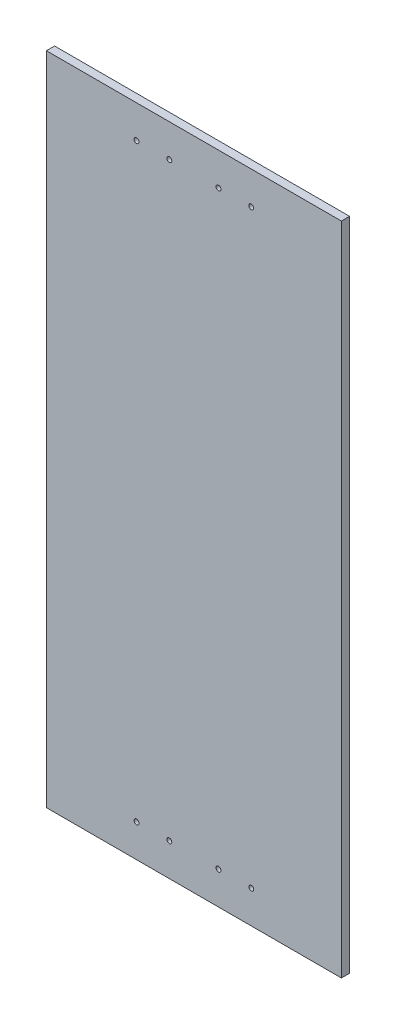
ISO-10303-21;
HEADER;
FILE_DESCRIPTION(('STEP AP214'),'2;1');
FILE_NAME('part.step','',(''),(''),'','','');
FILE_SCHEMA(('AUTOMOTIVE_DESIGN { 1 0 10303 214 1 1 1 1 }'));
ENDSEC;
DATA;
#1=APPLICATION_CONTEXT('core data for automotive mechanical design processes');
#2=APPLICATION_PROTOCOL_DEFINITION('international standard','automotive_design',2000,#1);
#3=PRODUCT_CONTEXT('',#1,'mechanical');
#4=PRODUCT('Part','Part','',(#3));
#5=PRODUCT_RELATED_PRODUCT_CATEGORY('part','',(#4));
#6=PRODUCT_DEFINITION_FORMATION('','',#4);
#7=PRODUCT_DEFINITION_CONTEXT('part definition',#1,'design');
#8=PRODUCT_DEFINITION('design','',#6,#7);
#9=PRODUCT_DEFINITION_SHAPE('','',#8);
#10=(LENGTH_UNIT() NAMED_UNIT(*) SI_UNIT(.MILLI.,.METRE.));
#11=(NAMED_UNIT(*) PLANE_ANGLE_UNIT() SI_UNIT($,.RADIAN.));
#12=(NAMED_UNIT(*) SI_UNIT($,.STERADIAN.) SOLID_ANGLE_UNIT());
#13=UNCERTAINTY_MEASURE_WITH_UNIT(LENGTH_MEASURE(1.E-05),#10,'distance_accuracy_value','');
#14=(GEOMETRIC_REPRESENTATION_CONTEXT(3) GLOBAL_UNCERTAINTY_ASSIGNED_CONTEXT((#13)) GLOBAL_UNIT_ASSIGNED_CONTEXT((#10,
#11,#12)) REPRESENTATION_CONTEXT('',''));
#15=CARTESIAN_POINT('',(0.,0.,0.));
#16=DIRECTION('',(0.,0.,1.));
#17=DIRECTION('',(1.,0.,0.));
#18=AXIS2_PLACEMENT_3D('',#15,#16,#17);
#19=CARTESIAN_POINT('',(0.,0.,5.));
#20=DIRECTION('',(0.,0.,-1.));
#21=DIRECTION('',(-1.,0.,0.));
#22=AXIS2_PLACEMENT_3D('',#19,#20,#21);
#23=PLANE('',#22);
#24=DIRECTION('',(0.,1.,0.));
#25=VECTOR('',#24,1.);
#26=CARTESIAN_POINT('',(90.,-200.,5.));
#27=LINE('',#26,#25);
#28=CARTESIAN_POINT('',(90.,-200.,5.));
#29=VERTEX_POINT('',#28);
#30=CARTESIAN_POINT('',(90.,200.,5.));
#31=VERTEX_POINT('',#30);
#32=EDGE_CURVE('E89',#29,#31,#27,.T.);
#33=ORIENTED_EDGE('',*,*,#32,.T.);
#34=DIRECTION('',(-1.,0.,0.));
#35=VECTOR('',#34,1.);
#36=CARTESIAN_POINT('',(-90.,200.,5.));
#37=LINE('',#36,#35);
#38=CARTESIAN_POINT('',(-90.,200.,5.));
#39=VERTEX_POINT('',#38);
#40=EDGE_CURVE('E84',#31,#39,#37,.T.);
#41=ORIENTED_EDGE('',*,*,#40,.T.);
#42=DIRECTION('',(0.,-1.,0.));
#43=VECTOR('',#42,1.);
#44=CARTESIAN_POINT('',(-90.,-200.,5.));
#45=LINE('',#44,#43);
#46=CARTESIAN_POINT('',(-90.,-200.,5.));
#47=VERTEX_POINT('',#46);
#48=EDGE_CURVE('E87',#39,#47,#45,.T.);
#49=ORIENTED_EDGE('',*,*,#48,.T.);
#50=DIRECTION('',(1.,0.,0.));
#51=VECTOR('',#50,1.);
#52=CARTESIAN_POINT('',(-90.,-200.,5.));
#53=LINE('',#52,#51);
#54=EDGE_CURVE('E54',#47,#29,#53,.T.);
#55=ORIENTED_EDGE('',*,*,#54,.T.);
#56=EDGE_LOOP('',(#33,#41,#49,#55));
#57=FACE_BOUND('',#56,.T.);
#58=CARTESIAN_POINT('',(15.,-180.,5.));
#59=DIRECTION('',(0.,0.,1.));
#60=DIRECTION('',(1.,0.,0.));
#61=AXIS2_PLACEMENT_3D('',#58,#59,#60);
#62=CIRCLE('',#61,1.5);
#63=CARTESIAN_POINT('',(16.5,-180.,5.));
#64=VERTEX_POINT('',#63);
#65=EDGE_CURVE('E104',#64,#64,#62,.T.);
#66=ORIENTED_EDGE('',*,*,#65,.F.);
#67=EDGE_LOOP('',(#66));
#68=FACE_BOUND('',#67,.T.);
#69=CARTESIAN_POINT('',(35.,-180.,5.));
#70=DIRECTION('',(0.,0.,1.));
#71=DIRECTION('',(1.,0.,0.));
#72=AXIS2_PLACEMENT_3D('',#69,#70,#71);
#73=CIRCLE('',#72,1.5);
#74=CARTESIAN_POINT('',(36.5,-180.,5.));
#75=VERTEX_POINT('',#74);
#76=EDGE_CURVE('E119',#75,#75,#73,.T.);
#77=ORIENTED_EDGE('',*,*,#76,.F.);
#78=EDGE_LOOP('',(#77));
#79=FACE_BOUND('',#78,.T.);
#80=CARTESIAN_POINT('',(-35.,-180.,5.));
#81=DIRECTION('',(0.,0.,1.));
#82=DIRECTION('',(-1.,0.,0.));
#83=AXIS2_PLACEMENT_3D('',#80,#81,#82);
#84=CIRCLE('',#83,1.5);
#85=CARTESIAN_POINT('',(-36.5,-180.,5.));
#86=VERTEX_POINT('',#85);
#87=EDGE_CURVE('E125',#86,#86,#84,.T.);
#88=ORIENTED_EDGE('',*,*,#87,.F.);
#89=EDGE_LOOP('',(#88));
#90=FACE_BOUND('',#89,.T.);
#91=CARTESIAN_POINT('',(-15.,-180.,5.));
#92=DIRECTION('',(0.,0.,1.));
#93=DIRECTION('',(-1.,0.,0.));
#94=AXIS2_PLACEMENT_3D('',#91,#92,#93);
#95=CIRCLE('',#94,1.5);
#96=CARTESIAN_POINT('',(-16.5,-180.,5.));
#97=VERTEX_POINT('',#96);
#98=EDGE_CURVE('E131',#97,#97,#95,.T.);
#99=ORIENTED_EDGE('',*,*,#98,.F.);
#100=EDGE_LOOP('',(#99));
#101=FACE_BOUND('',#100,.T.);
#102=CARTESIAN_POINT('',(35.,180.,5.));
#103=DIRECTION('',(0.,0.,1.));
#104=DIRECTION('',(1.,0.,0.));
#105=AXIS2_PLACEMENT_3D('',#102,#103,#104);
#106=CIRCLE('',#105,1.5);
#107=CARTESIAN_POINT('',(36.5,180.,5.));
#108=VERTEX_POINT('',#107);
#109=EDGE_CURVE('E137',#108,#108,#106,.T.);
#110=ORIENTED_EDGE('',*,*,#109,.F.);
#111=EDGE_LOOP('',(#110));
#112=FACE_BOUND('',#111,.T.);
#113=CARTESIAN_POINT('',(15.,180.,5.));
#114=DIRECTION('',(0.,0.,1.));
#115=DIRECTION('',(1.,0.,0.));
#116=AXIS2_PLACEMENT_3D('',#113,#114,#115);
#117=CIRCLE('',#116,1.5);
#118=CARTESIAN_POINT('',(16.5,180.,5.));
#119=VERTEX_POINT('',#118);
#120=EDGE_CURVE('E143',#119,#119,#117,.T.);
#121=ORIENTED_EDGE('',*,*,#120,.F.);
#122=EDGE_LOOP('',(#121));
#123=FACE_BOUND('',#122,.T.);
#124=CARTESIAN_POINT('',(-35.,180.,5.));
#125=DIRECTION('',(0.,0.,1.));
#126=DIRECTION('',(-1.,0.,0.));
#127=AXIS2_PLACEMENT_3D('',#124,#125,#126);
#128=CIRCLE('',#127,1.5);
#129=CARTESIAN_POINT('',(-36.5,180.,5.));
#130=VERTEX_POINT('',#129);
#131=EDGE_CURVE('E149',#130,#130,#128,.T.);
#132=ORIENTED_EDGE('',*,*,#131,.F.);
#133=EDGE_LOOP('',(#132));
#134=FACE_BOUND('',#133,.T.);
#135=CARTESIAN_POINT('',(-15.,180.,5.));
#136=DIRECTION('',(0.,0.,1.));
#137=DIRECTION('',(-1.,0.,0.));
#138=AXIS2_PLACEMENT_3D('',#135,#136,#137);
#139=CIRCLE('',#138,1.5);
#140=CARTESIAN_POINT('',(-16.5,180.,5.));
#141=VERTEX_POINT('',#140);
#142=EDGE_CURVE('E155',#141,#141,#139,.T.);
#143=ORIENTED_EDGE('',*,*,#142,.F.);
#144=EDGE_LOOP('',(#143));
#145=FACE_BOUND('',#144,.T.);
#146=ADVANCED_FACE('F37',(#57,#68,#79,#90,#101,#112,#123,#134,#145),#23,.F.);
#147=CARTESIAN_POINT('',(0.,0.,0.));
#148=DIRECTION('',(0.,0.,-1.));
#149=DIRECTION('',(-1.,0.,0.));
#150=AXIS2_PLACEMENT_3D('',#147,#148,#149);
#151=PLANE('',#150);
#152=CARTESIAN_POINT('',(-35.,180.,0.));
#153=DIRECTION('',(0.,0.,1.));
#154=DIRECTION('',(-1.,0.,0.));
#155=AXIS2_PLACEMENT_3D('',#152,#153,#154);
#156=CIRCLE('',#155,1.5);
#157=CARTESIAN_POINT('',(-36.5,180.,0.));
#158=VERTEX_POINT('',#157);
#159=EDGE_CURVE('E152',#158,#158,#156,.T.);
#160=ORIENTED_EDGE('',*,*,#159,.T.);
#161=EDGE_LOOP('',(#160));
#162=FACE_BOUND('',#161,.T.);
#163=CARTESIAN_POINT('',(35.,180.,0.));
#164=DIRECTION('',(0.,0.,1.));
#165=DIRECTION('',(1.,0.,0.));
#166=AXIS2_PLACEMENT_3D('',#163,#164,#165);
#167=CIRCLE('',#166,1.5);
#168=CARTESIAN_POINT('',(36.5,180.,0.));
#169=VERTEX_POINT('',#168);
#170=EDGE_CURVE('E140',#169,#169,#167,.T.);
#171=ORIENTED_EDGE('',*,*,#170,.T.);
#172=EDGE_LOOP('',(#171));
#173=FACE_BOUND('',#172,.T.);
#174=CARTESIAN_POINT('',(-35.,-180.,0.));
#175=DIRECTION('',(0.,0.,1.));
#176=DIRECTION('',(-1.,0.,0.));
#177=AXIS2_PLACEMENT_3D('',#174,#175,#176);
#178=CIRCLE('',#177,1.5);
#179=CARTESIAN_POINT('',(-36.5,-180.,0.));
#180=VERTEX_POINT('',#179);
#181=EDGE_CURVE('E128',#180,#180,#178,.T.);
#182=ORIENTED_EDGE('',*,*,#181,.T.);
#183=EDGE_LOOP('',(#182));
#184=FACE_BOUND('',#183,.T.);
#185=CARTESIAN_POINT('',(15.,-180.,0.));
#186=DIRECTION('',(0.,0.,1.));
#187=DIRECTION('',(1.,0.,0.));
#188=AXIS2_PLACEMENT_3D('',#185,#186,#187);
#189=CIRCLE('',#188,1.5);
#190=CARTESIAN_POINT('',(16.5,-180.,0.));
#191=VERTEX_POINT('',#190);
#192=EDGE_CURVE('E116',#191,#191,#189,.T.);
#193=ORIENTED_EDGE('',*,*,#192,.T.);
#194=EDGE_LOOP('',(#193));
#195=FACE_BOUND('',#194,.T.);
#196=DIRECTION('',(0.,1.,0.));
#197=VECTOR('',#196,1.);
#198=CARTESIAN_POINT('',(90.,-200.,0.));
#199=LINE('',#198,#197);
#200=CARTESIAN_POINT('',(90.,-200.,0.));
#201=VERTEX_POINT('',#200);
#202=CARTESIAN_POINT('',(90.,200.,0.));
#203=VERTEX_POINT('',#202);
#204=EDGE_CURVE('E101',#201,#203,#199,.T.);
#205=ORIENTED_EDGE('',*,*,#204,.F.);
#206=DIRECTION('',(1.,0.,0.));
#207=VECTOR('',#206,1.);
#208=CARTESIAN_POINT('',(-90.,-200.,0.));
#209=LINE('',#208,#207);
#210=CARTESIAN_POINT('',(-90.,-200.,0.));
#211=VERTEX_POINT('',#210);
#212=EDGE_CURVE('E77',#211,#201,#209,.T.);
#213=ORIENTED_EDGE('',*,*,#212,.F.);
#214=DIRECTION('',(0.,-1.,0.));
#215=VECTOR('',#214,1.);
#216=CARTESIAN_POINT('',(-90.,-200.,0.));
#217=LINE('',#216,#215);
#218=CARTESIAN_POINT('',(-90.,200.,0.));
#219=VERTEX_POINT('',#218);
#220=EDGE_CURVE('E71',#219,#211,#217,.T.);
#221=ORIENTED_EDGE('',*,*,#220,.F.);
#222=DIRECTION('',(-1.,0.,0.));
#223=VECTOR('',#222,1.);
#224=CARTESIAN_POINT('',(-90.,200.,0.));
#225=LINE('',#224,#223);
#226=EDGE_CURVE('E93',#203,#219,#225,.T.);
#227=ORIENTED_EDGE('',*,*,#226,.F.);
#228=EDGE_LOOP('',(#205,#213,#221,#227));
#229=FACE_BOUND('',#228,.T.);
#230=CARTESIAN_POINT('',(35.,-180.,0.));
#231=DIRECTION('',(0.,0.,1.));
#232=DIRECTION('',(1.,0.,0.));
#233=AXIS2_PLACEMENT_3D('',#230,#231,#232);
#234=CIRCLE('',#233,1.5);
#235=CARTESIAN_POINT('',(36.5,-180.,0.));
#236=VERTEX_POINT('',#235);
#237=EDGE_CURVE('E122',#236,#236,#234,.T.);
#238=ORIENTED_EDGE('',*,*,#237,.T.);
#239=EDGE_LOOP('',(#238));
#240=FACE_BOUND('',#239,.T.);
#241=CARTESIAN_POINT('',(-15.,-180.,0.));
#242=DIRECTION('',(0.,0.,1.));
#243=DIRECTION('',(-1.,0.,0.));
#244=AXIS2_PLACEMENT_3D('',#241,#242,#243);
#245=CIRCLE('',#244,1.5);
#246=CARTESIAN_POINT('',(-16.5,-180.,0.));
#247=VERTEX_POINT('',#246);
#248=EDGE_CURVE('E134',#247,#247,#245,.T.);
#249=ORIENTED_EDGE('',*,*,#248,.T.);
#250=EDGE_LOOP('',(#249));
#251=FACE_BOUND('',#250,.T.);
#252=CARTESIAN_POINT('',(15.,180.,0.));
#253=DIRECTION('',(0.,0.,1.));
#254=DIRECTION('',(1.,0.,0.));
#255=AXIS2_PLACEMENT_3D('',#252,#253,#254);
#256=CIRCLE('',#255,1.5);
#257=CARTESIAN_POINT('',(16.5,180.,0.));
#258=VERTEX_POINT('',#257);
#259=EDGE_CURVE('E146',#258,#258,#256,.T.);
#260=ORIENTED_EDGE('',*,*,#259,.T.);
#261=EDGE_LOOP('',(#260));
#262=FACE_BOUND('',#261,.T.);
#263=CARTESIAN_POINT('',(-15.,180.,0.));
#264=DIRECTION('',(0.,0.,1.));
#265=DIRECTION('',(-1.,0.,0.));
#266=AXIS2_PLACEMENT_3D('',#263,#264,#265);
#267=CIRCLE('',#266,1.5);
#268=CARTESIAN_POINT('',(-16.5,180.,0.));
#269=VERTEX_POINT('',#268);
#270=EDGE_CURVE('E158',#269,#269,#267,.T.);
#271=ORIENTED_EDGE('',*,*,#270,.T.);
#272=EDGE_LOOP('',(#271));
#273=FACE_BOUND('',#272,.T.);
#274=ADVANCED_FACE('F112',(#162,#173,#184,#195,#229,#240,#251,#262,#273),#151,.T.);
#275=CARTESIAN_POINT('',(90.,-200.,5.));
#276=DIRECTION('',(-1.,0.,0.));
#277=DIRECTION('',(0.,0.,1.));
#278=AXIS2_PLACEMENT_3D('',#275,#276,#277);
#279=PLANE('',#278);
#280=ORIENTED_EDGE('',*,*,#204,.T.);
#281=DIRECTION('',(0.,0.,-1.));
#282=VECTOR('',#281,1.);
#283=CARTESIAN_POINT('',(90.,200.,5.));
#284=LINE('',#283,#282);
#285=EDGE_CURVE('E11',#31,#203,#284,.T.);
#286=ORIENTED_EDGE('',*,*,#285,.F.);
#287=ORIENTED_EDGE('',*,*,#32,.F.);
#288=DIRECTION('',(0.,0.,-1.));
#289=VECTOR('',#288,1.);
#290=CARTESIAN_POINT('',(90.,-200.,5.));
#291=LINE('',#290,#289);
#292=EDGE_CURVE('E97',#29,#201,#291,.T.);
#293=ORIENTED_EDGE('',*,*,#292,.T.);
#294=EDGE_LOOP('',(#280,#286,#287,#293));
#295=FACE_BOUND('',#294,.T.);
#296=ADVANCED_FACE('F39',(#295),#279,.F.);
#297=CARTESIAN_POINT('',(-90.,200.,5.));
#298=DIRECTION('',(0.,-1.,0.));
#299=DIRECTION('',(1.,0.,0.));
#300=AXIS2_PLACEMENT_3D('',#297,#298,#299);
#301=PLANE('',#300);
#302=ORIENTED_EDGE('',*,*,#226,.T.);
#303=DIRECTION('',(0.,0.,-1.));
#304=VECTOR('',#303,1.);
#305=CARTESIAN_POINT('',(-90.,200.,5.));
#306=LINE('',#305,#304);
#307=EDGE_CURVE('E46',#39,#219,#306,.T.);
#308=ORIENTED_EDGE('',*,*,#307,.F.);
#309=ORIENTED_EDGE('',*,*,#40,.F.);
#310=ORIENTED_EDGE('',*,*,#285,.T.);
#311=EDGE_LOOP('',(#302,#308,#309,#310));
#312=FACE_BOUND('',#311,.T.);
#313=ADVANCED_FACE('F92',(#312),#301,.F.);
#314=CARTESIAN_POINT('',(-90.,-200.,5.));
#315=DIRECTION('',(1.,0.,0.));
#316=DIRECTION('',(0.,1.,0.));
#317=AXIS2_PLACEMENT_3D('',#314,#315,#316);
#318=PLANE('',#317);
#319=ORIENTED_EDGE('',*,*,#220,.T.);
#320=DIRECTION('',(0.,0.,-1.));
#321=VECTOR('',#320,1.);
#322=CARTESIAN_POINT('',(-90.,-200.,5.));
#323=LINE('',#322,#321);
#324=EDGE_CURVE('E94',#47,#211,#323,.T.);
#325=ORIENTED_EDGE('',*,*,#324,.F.);
#326=ORIENTED_EDGE('',*,*,#48,.F.);
#327=ORIENTED_EDGE('',*,*,#307,.T.);
#328=EDGE_LOOP('',(#319,#325,#326,#327));
#329=FACE_BOUND('',#328,.T.);
#330=ADVANCED_FACE('F95',(#329),#318,.F.);
#331=CARTESIAN_POINT('',(-90.,-200.,5.));
#332=DIRECTION('',(0.,1.,0.));
#333=DIRECTION('',(0.,0.,1.));
#334=AXIS2_PLACEMENT_3D('',#331,#332,#333);
#335=PLANE('',#334);
#336=ORIENTED_EDGE('',*,*,#212,.T.);
#337=ORIENTED_EDGE('',*,*,#292,.F.);
#338=ORIENTED_EDGE('',*,*,#54,.F.);
#339=ORIENTED_EDGE('',*,*,#324,.T.);
#340=EDGE_LOOP('',(#336,#337,#338,#339));
#341=FACE_BOUND('',#340,.T.);
#342=ADVANCED_FACE('F109',(#341),#335,.F.);
#343=CARTESIAN_POINT('',(15.,-180.,5.));
#344=DIRECTION('',(0.,0.,-1.));
#345=DIRECTION('',(-1.,0.,0.));
#346=AXIS2_PLACEMENT_3D('',#343,#344,#345);
#347=CYLINDRICAL_SURFACE('',#346,1.5);
#348=ORIENTED_EDGE('',*,*,#65,.T.);
#349=EDGE_LOOP('',(#348));
#350=FACE_BOUND('',#349,.T.);
#351=ORIENTED_EDGE('',*,*,#192,.F.);
#352=EDGE_LOOP('',(#351));
#353=FACE_BOUND('',#352,.T.);
#354=ADVANCED_FACE('F175',(#350,#353),#347,.F.);
#355=CARTESIAN_POINT('',(35.,-180.,5.));
#356=DIRECTION('',(0.,0.,-1.));
#357=DIRECTION('',(-1.,0.,0.));
#358=AXIS2_PLACEMENT_3D('',#355,#356,#357);
#359=CYLINDRICAL_SURFACE('',#358,1.5);
#360=ORIENTED_EDGE('',*,*,#76,.T.);
#361=EDGE_LOOP('',(#360));
#362=FACE_BOUND('',#361,.T.);
#363=ORIENTED_EDGE('',*,*,#237,.F.);
#364=EDGE_LOOP('',(#363));
#365=FACE_BOUND('',#364,.T.);
#366=ADVANCED_FACE('F229',(#362,#365),#359,.F.);
#367=CARTESIAN_POINT('',(-35.,-180.,5.));
#368=DIRECTION('',(0.,0.,-1.));
#369=DIRECTION('',(-1.,0.,0.));
#370=AXIS2_PLACEMENT_3D('',#367,#368,#369);
#371=CYLINDRICAL_SURFACE('',#370,1.5);
#372=ORIENTED_EDGE('',*,*,#87,.T.);
#373=EDGE_LOOP('',(#372));
#374=FACE_BOUND('',#373,.T.);
#375=ORIENTED_EDGE('',*,*,#181,.F.);
#376=EDGE_LOOP('',(#375));
#377=FACE_BOUND('',#376,.T.);
#378=ADVANCED_FACE('F238',(#374,#377),#371,.F.);
#379=CARTESIAN_POINT('',(-15.,-180.,5.));
#380=DIRECTION('',(0.,0.,-1.));
#381=DIRECTION('',(-1.,0.,0.));
#382=AXIS2_PLACEMENT_3D('',#379,#380,#381);
#383=CYLINDRICAL_SURFACE('',#382,1.5);
#384=ORIENTED_EDGE('',*,*,#98,.T.);
#385=EDGE_LOOP('',(#384));
#386=FACE_BOUND('',#385,.T.);
#387=ORIENTED_EDGE('',*,*,#248,.F.);
#388=EDGE_LOOP('',(#387));
#389=FACE_BOUND('',#388,.T.);
#390=ADVANCED_FACE('F247',(#386,#389),#383,.F.);
#391=CARTESIAN_POINT('',(35.,180.,5.));
#392=DIRECTION('',(0.,0.,-1.));
#393=DIRECTION('',(-1.,0.,0.));
#394=AXIS2_PLACEMENT_3D('',#391,#392,#393);
#395=CYLINDRICAL_SURFACE('',#394,1.5);
#396=ORIENTED_EDGE('',*,*,#109,.T.);
#397=EDGE_LOOP('',(#396));
#398=FACE_BOUND('',#397,.T.);
#399=ORIENTED_EDGE('',*,*,#170,.F.);
#400=EDGE_LOOP('',(#399));
#401=FACE_BOUND('',#400,.T.);
#402=ADVANCED_FACE('F257',(#398,#401),#395,.F.);
#403=CARTESIAN_POINT('',(15.,180.,5.));
#404=DIRECTION('',(0.,0.,-1.));
#405=DIRECTION('',(-1.,0.,0.));
#406=AXIS2_PLACEMENT_3D('',#403,#404,#405);
#407=CYLINDRICAL_SURFACE('',#406,1.5);
#408=ORIENTED_EDGE('',*,*,#120,.T.);
#409=EDGE_LOOP('',(#408));
#410=FACE_BOUND('',#409,.T.);
#411=ORIENTED_EDGE('',*,*,#259,.F.);
#412=EDGE_LOOP('',(#411));
#413=FACE_BOUND('',#412,.T.);
#414=ADVANCED_FACE('F267',(#410,#413),#407,.F.);
#415=CARTESIAN_POINT('',(-35.,180.,5.));
#416=DIRECTION('',(0.,0.,-1.));
#417=DIRECTION('',(-1.,0.,0.));
#418=AXIS2_PLACEMENT_3D('',#415,#416,#417);
#419=CYLINDRICAL_SURFACE('',#418,1.5);
#420=ORIENTED_EDGE('',*,*,#131,.T.);
#421=EDGE_LOOP('',(#420));
#422=FACE_BOUND('',#421,.T.);
#423=ORIENTED_EDGE('',*,*,#159,.F.);
#424=EDGE_LOOP('',(#423));
#425=FACE_BOUND('',#424,.T.);
#426=ADVANCED_FACE('F277',(#422,#425),#419,.F.);
#427=CARTESIAN_POINT('',(-15.,180.,5.));
#428=DIRECTION('',(0.,0.,-1.));
#429=DIRECTION('',(-1.,0.,0.));
#430=AXIS2_PLACEMENT_3D('',#427,#428,#429);
#431=CYLINDRICAL_SURFACE('',#430,1.5);
#432=ORIENTED_EDGE('',*,*,#142,.T.);
#433=EDGE_LOOP('',(#432));
#434=FACE_BOUND('',#433,.T.);
#435=ORIENTED_EDGE('',*,*,#270,.F.);
#436=EDGE_LOOP('',(#435));
#437=FACE_BOUND('',#436,.T.);
#438=ADVANCED_FACE('F164',(#434,#437),#431,.F.);
#439=CLOSED_SHELL('',(#146,#274,#296,#313,#330,#342,#354,#366,#378,#390,#402,#414,#426,#438));
#440=MANIFOLD_SOLID_BREP('B2',#439);
#441=ADVANCED_BREP_SHAPE_REPRESENTATION('',(#18,#440),#14);
#442=SHAPE_DEFINITION_REPRESENTATION(#9,#441);
ENDSEC;
END-ISO-10303-21;
